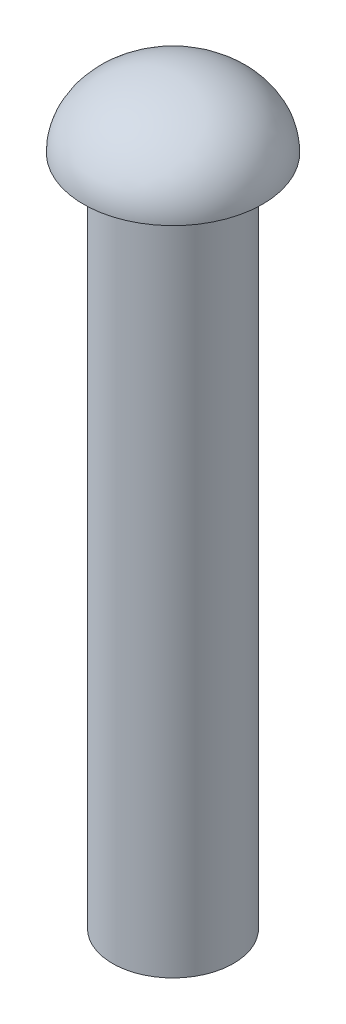
ISO-10303-21;
HEADER;
FILE_DESCRIPTION(('STEP AP214'),'2;1');
FILE_NAME('part.step','',(''),(''),'','','');
FILE_SCHEMA(('AUTOMOTIVE_DESIGN { 1 0 10303 214 1 1 1 1 }'));
ENDSEC;
DATA;
#1=APPLICATION_CONTEXT('core data for automotive mechanical design processes');
#2=APPLICATION_PROTOCOL_DEFINITION('international standard','automotive_design',2000,#1);
#3=PRODUCT_CONTEXT('',#1,'mechanical');
#4=PRODUCT('Part','Part','',(#3));
#5=PRODUCT_RELATED_PRODUCT_CATEGORY('part','',(#4));
#6=PRODUCT_DEFINITION_FORMATION('','',#4);
#7=PRODUCT_DEFINITION_CONTEXT('part definition',#1,'design');
#8=PRODUCT_DEFINITION('design','',#6,#7);
#9=PRODUCT_DEFINITION_SHAPE('','',#8);
#10=(LENGTH_UNIT() NAMED_UNIT(*) SI_UNIT(.MILLI.,.METRE.));
#11=(NAMED_UNIT(*) PLANE_ANGLE_UNIT() SI_UNIT($,.RADIAN.));
#12=(NAMED_UNIT(*) SI_UNIT($,.STERADIAN.) SOLID_ANGLE_UNIT());
#13=UNCERTAINTY_MEASURE_WITH_UNIT(LENGTH_MEASURE(1.E-05),#10,'distance_accuracy_value','');
#14=(GEOMETRIC_REPRESENTATION_CONTEXT(3) GLOBAL_UNCERTAINTY_ASSIGNED_CONTEXT((#13)) GLOBAL_UNIT_ASSIGNED_CONTEXT((#10,
#11,#12)) REPRESENTATION_CONTEXT('',''));
#15=CARTESIAN_POINT('',(0.,0.,0.));
#16=DIRECTION('',(0.,0.,1.));
#17=DIRECTION('',(1.,0.,0.));
#18=AXIS2_PLACEMENT_3D('',#15,#16,#17);
#19=CARTESIAN_POINT('',(0.,15.24,0.));
#20=DIRECTION('',(0.,-1.,0.));
#21=DIRECTION('',(0.,0.,-1.));
#22=AXIS2_PLACEMENT_3D('',#19,#20,#21);
#23=CYLINDRICAL_SURFACE('',#22,1.3716);
#24=CARTESIAN_POINT('',(0.,15.24,0.));
#25=DIRECTION('',(0.,1.,0.));
#26=DIRECTION('',(0.,0.,1.));
#27=AXIS2_PLACEMENT_3D('',#24,#25,#26);
#28=CIRCLE('',#27,1.3716);
#29=CARTESIAN_POINT('',(0.,15.24,-1.3716));
#30=VERTEX_POINT('',#29);
#31=EDGE_CURVE('E11',#30,#30,#28,.T.);
#32=CARTESIAN_POINT('',(0.,0.,0.));
#33=DIRECTION('',(0.,1.,0.));
#34=DIRECTION('',(0.,0.,1.));
#35=AXIS2_PLACEMENT_3D('',#32,#33,#34);
#36=CIRCLE('',#35,1.3716);
#37=CARTESIAN_POINT('',(0.,0.,-1.3716));
#38=VERTEX_POINT('',#37);
#39=EDGE_CURVE('E38',#38,#38,#36,.T.);
#40=CARTESIAN_POINT('',(0.,15.24,-1.3716));
#41=CARTESIAN_POINT('',(0.,15.08125,-1.3716));
#42=CARTESIAN_POINT('',(0.,14.9225,-1.3716));
#43=CARTESIAN_POINT('',(0.,14.605,-1.3716));
#44=CARTESIAN_POINT('',(0.,14.44625,-1.3716));
#45=CARTESIAN_POINT('',(0.,14.12875,-1.3716));
#46=CARTESIAN_POINT('',(0.,13.97,-1.3716));
#47=CARTESIAN_POINT('',(0.,13.6525,-1.3716));
#48=CARTESIAN_POINT('',(0.,13.49375,-1.3716));
#49=CARTESIAN_POINT('',(0.,13.17625,-1.3716));
#50=CARTESIAN_POINT('',(0.,13.0175,-1.3716));
#51=CARTESIAN_POINT('',(0.,12.7,-1.3716));
#52=CARTESIAN_POINT('',(0.,12.54125,-1.3716));
#53=CARTESIAN_POINT('',(0.,12.22375,-1.3716));
#54=CARTESIAN_POINT('',(0.,12.065,-1.3716));
#55=CARTESIAN_POINT('',(0.,11.7475,-1.3716));
#56=CARTESIAN_POINT('',(0.,11.58875,-1.3716));
#57=CARTESIAN_POINT('',(0.,11.27125,-1.3716));
#58=CARTESIAN_POINT('',(0.,11.1125,-1.3716));
#59=CARTESIAN_POINT('',(0.,10.795,-1.3716));
#60=CARTESIAN_POINT('',(0.,10.63625,-1.3716));
#61=CARTESIAN_POINT('',(0.,10.31875,-1.3716));
#62=CARTESIAN_POINT('',(0.,10.16,-1.3716));
#63=CARTESIAN_POINT('',(0.,9.8425,-1.3716));
#64=CARTESIAN_POINT('',(0.,9.68375,-1.3716));
#65=CARTESIAN_POINT('',(0.,9.36625,-1.3716));
#66=CARTESIAN_POINT('',(0.,9.2075,-1.3716));
#67=CARTESIAN_POINT('',(0.,8.89,-1.3716));
#68=CARTESIAN_POINT('',(0.,8.73125,-1.3716));
#69=CARTESIAN_POINT('',(0.,8.41375,-1.3716));
#70=CARTESIAN_POINT('',(0.,8.255,-1.3716));
#71=CARTESIAN_POINT('',(0.,7.9375,-1.3716));
#72=CARTESIAN_POINT('',(0.,7.77875,-1.3716));
#73=CARTESIAN_POINT('',(0.,7.46125,-1.3716));
#74=CARTESIAN_POINT('',(0.,7.3025,-1.3716));
#75=CARTESIAN_POINT('',(0.,6.985,-1.3716));
#76=CARTESIAN_POINT('',(0.,6.82625,-1.3716));
#77=CARTESIAN_POINT('',(0.,6.50875,-1.3716));
#78=CARTESIAN_POINT('',(0.,6.35,-1.3716));
#79=CARTESIAN_POINT('',(0.,6.0325,-1.3716));
#80=CARTESIAN_POINT('',(0.,5.87375,-1.3716));
#81=CARTESIAN_POINT('',(0.,5.55625,-1.3716));
#82=CARTESIAN_POINT('',(0.,5.3975,-1.3716));
#83=CARTESIAN_POINT('',(0.,5.08,-1.3716));
#84=CARTESIAN_POINT('',(0.,4.92125,-1.3716));
#85=CARTESIAN_POINT('',(0.,4.60375,-1.3716));
#86=CARTESIAN_POINT('',(0.,4.445,-1.3716));
#87=CARTESIAN_POINT('',(0.,4.1275,-1.3716));
#88=CARTESIAN_POINT('',(0.,3.96875,-1.3716));
#89=CARTESIAN_POINT('',(0.,3.65125,-1.3716));
#90=CARTESIAN_POINT('',(0.,3.4925,-1.3716));
#91=CARTESIAN_POINT('',(0.,3.175,-1.3716));
#92=CARTESIAN_POINT('',(0.,3.01625,-1.3716));
#93=CARTESIAN_POINT('',(0.,2.69875,-1.3716));
#94=CARTESIAN_POINT('',(0.,2.54,-1.3716));
#95=CARTESIAN_POINT('',(0.,2.2225,-1.3716));
#96=CARTESIAN_POINT('',(0.,2.06375,-1.3716));
#97=CARTESIAN_POINT('',(0.,1.74625,-1.3716));
#98=CARTESIAN_POINT('',(0.,1.5875,-1.3716));
#99=CARTESIAN_POINT('',(0.,1.27,-1.3716));
#100=CARTESIAN_POINT('',(0.,1.11125,-1.3716));
#101=CARTESIAN_POINT('',(0.,0.79375,-1.3716));
#102=CARTESIAN_POINT('',(0.,0.634999999999999,-1.3716));
#103=CARTESIAN_POINT('',(0.,0.3175,-1.3716));
#104=CARTESIAN_POINT('',(0.,0.15875,-1.3716));
#105=CARTESIAN_POINT('',(0.,0.,-1.3716));
#106=B_SPLINE_CURVE_WITH_KNOTS('',3,(#40,#41,#42,#43,#44,#45,#46,#47,#48,#49,#50,#51,#52,#53,
#54,#55,#56,#57,#58,#59,#60,#61,#62,#63,#64,#65,#66,#67,#68,#69,#70,#71,#72,#73,#74,#75,#76,#77,
#78,#79,#80,#81,#82,#83,#84,#85,#86,#87,#88,#89,#90,#91,#92,#93,#94,#95,#96,#97,#98,#99,#100,
#101,#102,#103,#104,#105),.UNSPECIFIED.,.F.,.F.,(4,2,2,2,2,2,2,2,2,2,2,2,2,2,2,2,2,2,2,2,2,2,2,
2,2,2,2,2,2,2,2,2,4),(0.,0.476250000000001,0.9525,1.42875,1.905,2.38125,2.8575,3.33375,3.81,
4.28625,4.7625,5.23875,5.715,6.19125,6.6675,7.14375,7.62,8.09625,8.5725,9.04875,9.525,10.00125,
10.4775,10.95375,11.43,11.90625,12.3825,12.85875,13.335,13.81125,14.2875,14.76375,15.24),.UNSPECIFIED.);
#107=EDGE_CURVE('BSEAM35',#30,#38,#106,.T.);
#108=ORIENTED_EDGE('',*,*,#31,.F.);
#109=ORIENTED_EDGE('',*,*,#39,.T.);
#110=ORIENTED_EDGE('',*,*,#107,.T.);
#111=ORIENTED_EDGE('',*,*,#107,.F.);
#112=EDGE_LOOP('',(#108,#110,#109,#111));
#113=FACE_BOUND('',#112,.T.);
#114=ADVANCED_FACE('F35',(#113),#23,.T.);
#115=CARTESIAN_POINT('',(0.,0.,0.));
#116=DIRECTION('',(0.,1.,0.));
#117=DIRECTION('',(0.,0.,1.));
#118=AXIS2_PLACEMENT_3D('',#115,#116,#117);
#119=PLANE('',#118);
#120=ORIENTED_EDGE('',*,*,#39,.F.);
#121=EDGE_LOOP('',(#120));
#122=FACE_BOUND('',#121,.T.);
#123=ADVANCED_FACE('F48',(#122),#119,.F.);
#124=CARTESIAN_POINT('',(0.,15.24,0.));
#125=DIRECTION('',(0.,0.,1.));
#126=DIRECTION('',(1.,0.,0.));
#127=AXIS2_PLACEMENT_3D('',#124,#125,#126);
#128=ELLIPSE('',#127,2.032,1.524);
#129=TRIMMED_CURVE('',#128,(PARAMETER_VALUE(-1.5707963267949)),
(PARAMETER_VALUE(1.5707963267949)),.T.,.PARAMETER.);
#130=CARTESIAN_POINT('',(0.,15.24,0.));
#131=DIRECTION('',(0.,-1.,0.));
#132=AXIS1_PLACEMENT('',#130,#131);
#133=SURFACE_OF_REVOLUTION('',#129,#132);
#134=CARTESIAN_POINT('',(0.,16.764,0.));
#135=VERTEX_POINT('',#134);
#136=VERTEX_LOOP('',#135);
#137=FACE_BOUND('',#136,.T.);
#138=CARTESIAN_POINT('',(0.,15.24,0.));
#139=DIRECTION('',(0.,-1.,0.));
#140=DIRECTION('',(1.,0.,0.));
#141=AXIS2_PLACEMENT_3D('',#138,#139,#140);
#142=CIRCLE('',#141,2.032);
#143=CARTESIAN_POINT('',(2.032,15.24,0.));
#144=VERTEX_POINT('',#143);
#145=EDGE_CURVE('E52',#144,#144,#142,.T.);
#146=ORIENTED_EDGE('',*,*,#145,.F.);
#147=EDGE_LOOP('',(#146));
#148=FACE_BOUND('',#147,.T.);
#149=ADVANCED_FACE('F44',(#137,#148),#133,.F.);
#150=CARTESIAN_POINT('',(0.,15.24,0.));
#151=DIRECTION('',(0.,-1.,0.));
#152=DIRECTION('',(1.,0.,0.));
#153=AXIS2_PLACEMENT_3D('',#150,#151,#152);
#154=PLANE('',#153);
#155=ORIENTED_EDGE('',*,*,#31,.T.);
#156=EDGE_LOOP('',(#155));
#157=FACE_BOUND('',#156,.T.);
#158=ORIENTED_EDGE('',*,*,#145,.T.);
#159=EDGE_LOOP('',(#158));
#160=FACE_BOUND('',#159,.T.);
#161=ADVANCED_FACE('F47',(#157,#160),#154,.T.);
#162=CLOSED_SHELL('',(#114,#123,#149,#161));
#163=MANIFOLD_SOLID_BREP('B2',#162);
#164=ADVANCED_BREP_SHAPE_REPRESENTATION('',(#18,#163),#14);
#165=SHAPE_DEFINITION_REPRESENTATION(#9,#164);
ENDSEC;
END-ISO-10303-21;
